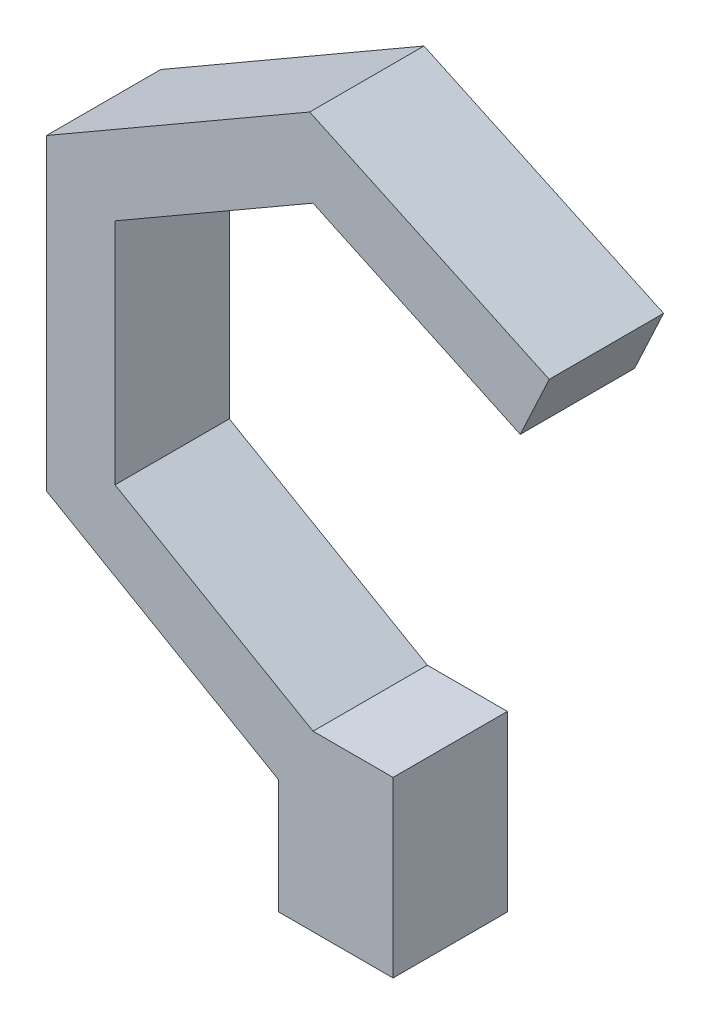
ISO-10303-21;
HEADER;
FILE_DESCRIPTION(('STEP AP214'),'2;1');
FILE_NAME('part.step','',(''),(''),'','','');
FILE_SCHEMA(('AUTOMOTIVE_DESIGN { 1 0 10303 214 1 1 1 1 }'));
ENDSEC;
DATA;
#1=APPLICATION_CONTEXT('core data for automotive mechanical design processes');
#2=APPLICATION_PROTOCOL_DEFINITION('international standard','automotive_design',2000,#1);
#3=PRODUCT_CONTEXT('',#1,'mechanical');
#4=PRODUCT('Part','Part','',(#3));
#5=PRODUCT_RELATED_PRODUCT_CATEGORY('part','',(#4));
#6=PRODUCT_DEFINITION_FORMATION('','',#4);
#7=PRODUCT_DEFINITION_CONTEXT('part definition',#1,'design');
#8=PRODUCT_DEFINITION('design','',#6,#7);
#9=PRODUCT_DEFINITION_SHAPE('','',#8);
#10=(LENGTH_UNIT() NAMED_UNIT(*) SI_UNIT(.MILLI.,.METRE.));
#11=(NAMED_UNIT(*) PLANE_ANGLE_UNIT() SI_UNIT($,.RADIAN.));
#12=(NAMED_UNIT(*) SI_UNIT($,.STERADIAN.) SOLID_ANGLE_UNIT());
#13=UNCERTAINTY_MEASURE_WITH_UNIT(LENGTH_MEASURE(1.E-05),#10,'distance_accuracy_value','');
#14=(GEOMETRIC_REPRESENTATION_CONTEXT(3) GLOBAL_UNCERTAINTY_ASSIGNED_CONTEXT((#13)) GLOBAL_UNIT_ASSIGNED_CONTEXT((#10,
#11,#12)) REPRESENTATION_CONTEXT('',''));
#15=CARTESIAN_POINT('',(0.,0.,0.));
#16=DIRECTION('',(0.,0.,1.));
#17=DIRECTION('',(1.,0.,0.));
#18=AXIS2_PLACEMENT_3D('',#15,#16,#17);
#19=CARTESIAN_POINT('',(0.,-25.4,12.7));
#20=DIRECTION('',(0.,-1.,0.));
#21=DIRECTION('',(0.,0.,-1.));
#22=AXIS2_PLACEMENT_3D('',#19,#20,#21);
#23=PLANE('',#22);
#24=DIRECTION('',(-1.,0.,0.));
#25=VECTOR('',#24,1.);
#26=CARTESIAN_POINT('',(0.,-25.4,0.));
#27=LINE('',#26,#25);
#28=CARTESIAN_POINT('',(8.89,-25.4,0.));
#29=VERTEX_POINT('',#28);
#30=CARTESIAN_POINT('',(0.,-25.4,0.));
#31=VERTEX_POINT('',#30);
#32=EDGE_CURVE('E159',#29,#31,#27,.T.);
#33=ORIENTED_EDGE('',*,*,#32,.T.);
#34=DIRECTION('',(0.,0.,-1.));
#35=VECTOR('',#34,1.);
#36=CARTESIAN_POINT('',(0.,-25.4,12.7));
#37=LINE('',#36,#35);
#38=CARTESIAN_POINT('',(0.,-25.4,12.7));
#39=VERTEX_POINT('',#38);
#40=EDGE_CURVE('E11',#39,#31,#37,.T.);
#41=ORIENTED_EDGE('',*,*,#40,.F.);
#42=DIRECTION('',(-1.,0.,0.));
#43=VECTOR('',#42,1.);
#44=CARTESIAN_POINT('',(0.,-25.4,12.7));
#45=LINE('',#44,#43);
#46=CARTESIAN_POINT('',(8.89,-25.4,12.7));
#47=VERTEX_POINT('',#46);
#48=EDGE_CURVE('E183',#47,#39,#45,.T.);
#49=ORIENTED_EDGE('',*,*,#48,.F.);
#50=DIRECTION('',(0.,0.,-1.));
#51=VECTOR('',#50,1.);
#52=CARTESIAN_POINT('',(8.89,-25.4,12.7));
#53=LINE('',#52,#51);
#54=EDGE_CURVE('E155',#47,#29,#53,.T.);
#55=ORIENTED_EDGE('',*,*,#54,.T.);
#56=EDGE_LOOP('',(#33,#41,#49,#55));
#57=FACE_BOUND('',#56,.T.);
#58=ADVANCED_FACE('F33',(#57),#23,.F.);
#59=CARTESIAN_POINT('',(0.,-25.4,12.7));
#60=DIRECTION('',(-0.5,-0.866025403784439,0.));
#61=DIRECTION('',(0.866025403784439,-0.5,0.));
#62=AXIS2_PLACEMENT_3D('',#59,#60,#61);
#63=PLANE('',#62);
#64=DIRECTION('',(-0.866025403784439,0.5,0.));
#65=VECTOR('',#64,1.);
#66=CARTESIAN_POINT('',(0.,-25.4,0.));
#67=LINE('',#66,#65);
#68=CARTESIAN_POINT('',(-21.9970452561247,-12.7,0.));
#69=VERTEX_POINT('',#68);
#70=EDGE_CURVE('E162',#31,#69,#67,.T.);
#71=ORIENTED_EDGE('',*,*,#70,.T.);
#72=DIRECTION('',(0.,0.,-1.));
#73=VECTOR('',#72,1.);
#74=CARTESIAN_POINT('',(-21.9970452561247,-12.7,12.7));
#75=LINE('',#74,#73);
#76=CARTESIAN_POINT('',(-21.9970452561247,-12.7,12.7));
#77=VERTEX_POINT('',#76);
#78=EDGE_CURVE('E41',#77,#69,#75,.T.);
#79=ORIENTED_EDGE('',*,*,#78,.F.);
#80=DIRECTION('',(-0.866025403784439,0.5,0.));
#81=VECTOR('',#80,1.);
#82=CARTESIAN_POINT('',(0.,-25.4,12.7));
#83=LINE('',#82,#81);
#84=EDGE_CURVE('E107',#39,#77,#83,.T.);
#85=ORIENTED_EDGE('',*,*,#84,.F.);
#86=ORIENTED_EDGE('',*,*,#40,.T.);
#87=EDGE_LOOP('',(#71,#79,#85,#86));
#88=FACE_BOUND('',#87,.T.);
#89=ADVANCED_FACE('F266',(#88),#63,.F.);
#90=CARTESIAN_POINT('',(-21.9970452561247,-12.7,12.7));
#91=DIRECTION('',(-1.,0.,0.));
#92=DIRECTION('',(0.,0.,1.));
#93=AXIS2_PLACEMENT_3D('',#90,#91,#92);
#94=PLANE('',#93);
#95=DIRECTION('',(0.,1.,0.));
#96=VECTOR('',#95,1.);
#97=CARTESIAN_POINT('',(-21.9970452561247,-12.7,0.));
#98=LINE('',#97,#96);
#99=CARTESIAN_POINT('',(-21.9970452561247,12.7,0.));
#100=VERTEX_POINT('',#99);
#101=EDGE_CURVE('E164',#69,#100,#98,.T.);
#102=ORIENTED_EDGE('',*,*,#101,.T.);
#103=DIRECTION('',(0.,0.,-1.));
#104=VECTOR('',#103,1.);
#105=CARTESIAN_POINT('',(-21.9970452561247,12.7,12.7));
#106=LINE('',#105,#104);
#107=CARTESIAN_POINT('',(-21.9970452561247,12.7,12.7));
#108=VERTEX_POINT('',#107);
#109=EDGE_CURVE('E205',#108,#100,#106,.T.);
#110=ORIENTED_EDGE('',*,*,#109,.F.);
#111=DIRECTION('',(0.,1.,0.));
#112=VECTOR('',#111,1.);
#113=CARTESIAN_POINT('',(-21.9970452561247,-12.7,12.7));
#114=LINE('',#113,#112);
#115=EDGE_CURVE('E213',#77,#108,#114,.T.);
#116=ORIENTED_EDGE('',*,*,#115,.F.);
#117=ORIENTED_EDGE('',*,*,#78,.T.);
#118=EDGE_LOOP('',(#102,#110,#116,#117));
#119=FACE_BOUND('',#118,.T.);
#120=ADVANCED_FACE('F211',(#119),#94,.F.);
#121=CARTESIAN_POINT('',(-21.9970452561247,12.7,12.7));
#122=DIRECTION('',(-0.5,0.866025403784439,0.));
#123=DIRECTION('',(-0.866025403784439,-0.5,0.));
#124=AXIS2_PLACEMENT_3D('',#121,#122,#123);
#125=PLANE('',#124);
#126=DIRECTION('',(0.866025403784438,0.5,0.));
#127=VECTOR('',#126,1.);
#128=CARTESIAN_POINT('',(-21.9970452561247,12.7,0.));
#129=LINE('',#128,#127);
#130=CARTESIAN_POINT('',(0.,25.4,0.));
#131=VERTEX_POINT('',#130);
#132=EDGE_CURVE('E166',#100,#131,#129,.T.);
#133=ORIENTED_EDGE('',*,*,#132,.T.);
#134=DIRECTION('',(0.,0.,-1.));
#135=VECTOR('',#134,1.);
#136=CARTESIAN_POINT('',(0.,25.4,12.7));
#137=LINE('',#136,#135);
#138=CARTESIAN_POINT('',(0.,25.4,12.7));
#139=VERTEX_POINT('',#138);
#140=EDGE_CURVE('E202',#139,#131,#137,.T.);
#141=ORIENTED_EDGE('',*,*,#140,.F.);
#142=DIRECTION('',(0.866025403784438,0.5,0.));
#143=VECTOR('',#142,1.);
#144=CARTESIAN_POINT('',(-21.9970452561247,12.7,12.7));
#145=LINE('',#144,#143);
#146=EDGE_CURVE('E231',#108,#139,#145,.T.);
#147=ORIENTED_EDGE('',*,*,#146,.F.);
#148=ORIENTED_EDGE('',*,*,#109,.T.);
#149=EDGE_LOOP('',(#133,#141,#147,#148));
#150=FACE_BOUND('',#149,.T.);
#151=ADVANCED_FACE('F222',(#150),#125,.F.);
#152=CARTESIAN_POINT('',(0.,25.4,12.7));
#153=DIRECTION('',(0.422618261740701,0.906307787036649,0.));
#154=DIRECTION('',(-0.906307787036649,0.422618261740701,0.));
#155=AXIS2_PLACEMENT_3D('',#152,#153,#154);
#156=PLANE('',#155);
#157=DIRECTION('',(0.906307787036649,-0.422618261740701,0.));
#158=VECTOR('',#157,1.);
#159=CARTESIAN_POINT('',(0.,25.4,0.));
#160=LINE('',#159,#158);
#161=CARTESIAN_POINT('',(23.0202177907309,14.6654961517862,0.));
#162=VERTEX_POINT('',#161);
#163=EDGE_CURVE('E168',#131,#162,#160,.T.);
#164=ORIENTED_EDGE('',*,*,#163,.T.);
#165=DIRECTION('',(0.,0.,-1.));
#166=VECTOR('',#165,1.);
#167=CARTESIAN_POINT('',(23.0202177907309,14.6654961517862,12.7));
#168=LINE('',#167,#166);
#169=CARTESIAN_POINT('',(23.0202177907309,14.6654961517862,12.7));
#170=VERTEX_POINT('',#169);
#171=EDGE_CURVE('E199',#170,#162,#168,.T.);
#172=ORIENTED_EDGE('',*,*,#171,.F.);
#173=DIRECTION('',(0.906307787036649,-0.422618261740701,0.));
#174=VECTOR('',#173,1.);
#175=CARTESIAN_POINT('',(0.,25.4,12.7));
#176=LINE('',#175,#174);
#177=EDGE_CURVE('E228',#139,#170,#176,.T.);
#178=ORIENTED_EDGE('',*,*,#177,.F.);
#179=ORIENTED_EDGE('',*,*,#140,.T.);
#180=EDGE_LOOP('',(#164,#172,#178,#179));
#181=FACE_BOUND('',#180,.T.);
#182=ADVANCED_FACE('F226',(#181),#156,.F.);
#183=CARTESIAN_POINT('',(26.240568945195,21.5715614890055,12.7));
#184=DIRECTION('',(-0.906307787036649,0.422618261740702,0.));
#185=DIRECTION('',(-0.422618261740702,-0.906307787036649,0.));
#186=AXIS2_PLACEMENT_3D('',#183,#184,#185);
#187=PLANE('',#186);
#188=DIRECTION('',(0.422618261740702,0.906307787036649,0.));
#189=VECTOR('',#188,1.);
#190=CARTESIAN_POINT('',(26.240568945195,21.5715614890055,0.));
#191=LINE('',#190,#189);
#192=CARTESIAN_POINT('',(26.240568945195,21.5715614890055,0.));
#193=VERTEX_POINT('',#192);
#194=EDGE_CURVE('E170',#162,#193,#191,.T.);
#195=ORIENTED_EDGE('',*,*,#194,.T.);
#196=DIRECTION('',(0.,0.,-1.));
#197=VECTOR('',#196,1.);
#198=CARTESIAN_POINT('',(26.240568945195,21.5715614890055,12.7));
#199=LINE('',#198,#197);
#200=CARTESIAN_POINT('',(26.240568945195,21.5715614890055,12.7));
#201=VERTEX_POINT('',#200);
#202=EDGE_CURVE('E196',#201,#193,#199,.T.);
#203=ORIENTED_EDGE('',*,*,#202,.F.);
#204=DIRECTION('',(0.422618261740702,0.906307787036649,0.));
#205=VECTOR('',#204,1.);
#206=CARTESIAN_POINT('',(26.240568945195,21.5715614890055,12.7));
#207=LINE('',#206,#205);
#208=EDGE_CURVE('E230',#170,#201,#207,.T.);
#209=ORIENTED_EDGE('',*,*,#208,.F.);
#210=ORIENTED_EDGE('',*,*,#171,.T.);
#211=EDGE_LOOP('',(#195,#203,#209,#210));
#212=FACE_BOUND('',#211,.T.);
#213=ADVANCED_FACE('F279',(#212),#187,.F.);
#214=CARTESIAN_POINT('',(-0.374718909049764,33.9824740394396,12.7));
#215=DIRECTION('',(-0.422618261740701,-0.906307787036649,0.));
#216=DIRECTION('',(0.906307787036649,-0.422618261740701,0.));
#217=AXIS2_PLACEMENT_3D('',#214,#215,#216);
#218=PLANE('',#217);
#219=DIRECTION('',(-0.906307787036649,0.422618261740701,0.));
#220=VECTOR('',#219,1.);
#221=CARTESIAN_POINT('',(-0.374718909049764,33.9824740394396,0.));
#222=LINE('',#221,#220);
#223=CARTESIAN_POINT('',(-0.374718909049764,33.9824740394396,0.));
#224=VERTEX_POINT('',#223);
#225=EDGE_CURVE('E172',#193,#224,#222,.T.);
#226=ORIENTED_EDGE('',*,*,#225,.T.);
#227=DIRECTION('',(0.,0.,-1.));
#228=VECTOR('',#227,1.);
#229=CARTESIAN_POINT('',(-0.374718909049764,33.9824740394396,12.7));
#230=LINE('',#229,#228);
#231=CARTESIAN_POINT('',(-0.374718909049764,33.9824740394396,12.7));
#232=VERTEX_POINT('',#231);
#233=EDGE_CURVE('E193',#232,#224,#230,.T.);
#234=ORIENTED_EDGE('',*,*,#233,.F.);
#235=DIRECTION('',(-0.906307787036649,0.422618261740701,0.));
#236=VECTOR('',#235,1.);
#237=CARTESIAN_POINT('',(-0.374718909049764,33.9824740394396,12.7));
#238=LINE('',#237,#236);
#239=EDGE_CURVE('E233',#201,#232,#238,.T.);
#240=ORIENTED_EDGE('',*,*,#239,.F.);
#241=ORIENTED_EDGE('',*,*,#202,.T.);
#242=EDGE_LOOP('',(#226,#234,#240,#241));
#243=FACE_BOUND('',#242,.T.);
#244=ADVANCED_FACE('F282',(#243),#218,.F.);
#245=CARTESIAN_POINT('',(-29.6170452561247,17.0994090512249,12.7));
#246=DIRECTION('',(0.5,-0.866025403784438,0.));
#247=DIRECTION('',(0.866025403784439,0.5,0.));
#248=AXIS2_PLACEMENT_3D('',#245,#246,#247);
#249=PLANE('',#248);
#250=DIRECTION('',(-0.866025403784439,-0.5,0.));
#251=VECTOR('',#250,1.);
#252=CARTESIAN_POINT('',(-29.6170452561247,17.0994090512249,0.));
#253=LINE('',#252,#251);
#254=CARTESIAN_POINT('',(-29.6170452561247,17.0994090512249,0.));
#255=VERTEX_POINT('',#254);
#256=EDGE_CURVE('E174',#224,#255,#253,.T.);
#257=ORIENTED_EDGE('',*,*,#256,.T.);
#258=DIRECTION('',(0.,0.,-1.));
#259=VECTOR('',#258,1.);
#260=CARTESIAN_POINT('',(-29.6170452561247,17.0994090512249,12.7));
#261=LINE('',#260,#259);
#262=CARTESIAN_POINT('',(-29.6170452561247,17.0994090512249,12.7));
#263=VERTEX_POINT('',#262);
#264=EDGE_CURVE('E190',#263,#255,#261,.T.);
#265=ORIENTED_EDGE('',*,*,#264,.F.);
#266=DIRECTION('',(-0.866025403784439,-0.5,0.));
#267=VECTOR('',#266,1.);
#268=CARTESIAN_POINT('',(-29.6170452561247,17.0994090512249,12.7));
#269=LINE('',#268,#267);
#270=EDGE_CURVE('E239',#232,#263,#269,.T.);
#271=ORIENTED_EDGE('',*,*,#270,.F.);
#272=ORIENTED_EDGE('',*,*,#233,.T.);
#273=EDGE_LOOP('',(#257,#265,#271,#272));
#274=FACE_BOUND('',#273,.T.);
#275=ADVANCED_FACE('F286',(#274),#249,.F.);
#276=CARTESIAN_POINT('',(-29.6170452561247,-17.0994090512249,12.7));
#277=DIRECTION('',(1.,0.,0.));
#278=DIRECTION('',(0.,0.,-1.));
#279=AXIS2_PLACEMENT_3D('',#276,#277,#278);
#280=PLANE('',#279);
#281=DIRECTION('',(0.,-1.,0.));
#282=VECTOR('',#281,1.);
#283=CARTESIAN_POINT('',(-29.6170452561247,-17.0994090512249,0.));
#284=LINE('',#283,#282);
#285=CARTESIAN_POINT('',(-29.6170452561247,-17.0994090512249,0.));
#286=VERTEX_POINT('',#285);
#287=EDGE_CURVE('E176',#255,#286,#284,.T.);
#288=ORIENTED_EDGE('',*,*,#287,.T.);
#289=DIRECTION('',(0.,0.,-1.));
#290=VECTOR('',#289,1.);
#291=CARTESIAN_POINT('',(-29.6170452561247,-17.0994090512249,12.7));
#292=LINE('',#291,#290);
#293=CARTESIAN_POINT('',(-29.6170452561247,-17.0994090512249,12.7));
#294=VERTEX_POINT('',#293);
#295=EDGE_CURVE('E187',#294,#286,#292,.T.);
#296=ORIENTED_EDGE('',*,*,#295,.F.);
#297=DIRECTION('',(0.,-1.,0.));
#298=VECTOR('',#297,1.);
#299=CARTESIAN_POINT('',(-29.6170452561247,-17.0994090512249,12.7));
#300=LINE('',#299,#298);
#301=EDGE_CURVE('E241',#263,#294,#300,.T.);
#302=ORIENTED_EDGE('',*,*,#301,.F.);
#303=ORIENTED_EDGE('',*,*,#264,.T.);
#304=EDGE_LOOP('',(#288,#296,#302,#303));
#305=FACE_BOUND('',#304,.T.);
#306=ADVANCED_FACE('F247',(#305),#280,.F.);
#307=CARTESIAN_POINT('',(-3.81,-31.9991135768374,12.7));
#308=DIRECTION('',(0.5,0.866025403784439,0.));
#309=DIRECTION('',(-0.866025403784439,0.5,0.));
#310=AXIS2_PLACEMENT_3D('',#307,#308,#309);
#311=PLANE('',#310);
#312=DIRECTION('',(0.866025403784439,-0.5,0.));
#313=VECTOR('',#312,1.);
#314=CARTESIAN_POINT('',(-3.81,-31.9991135768374,0.));
#315=LINE('',#314,#313);
#316=CARTESIAN_POINT('',(-3.81,-31.9991135768374,0.));
#317=VERTEX_POINT('',#316);
#318=EDGE_CURVE('E178',#286,#317,#315,.T.);
#319=ORIENTED_EDGE('',*,*,#318,.T.);
#320=DIRECTION('',(0.,0.,-1.));
#321=VECTOR('',#320,1.);
#322=CARTESIAN_POINT('',(-3.81,-31.9991135768374,12.7));
#323=LINE('',#322,#321);
#324=CARTESIAN_POINT('',(-3.81,-31.9991135768374,12.7));
#325=VERTEX_POINT('',#324);
#326=EDGE_CURVE('E150',#325,#317,#323,.T.);
#327=ORIENTED_EDGE('',*,*,#326,.F.);
#328=DIRECTION('',(0.866025403784439,-0.5,0.));
#329=VECTOR('',#328,1.);
#330=CARTESIAN_POINT('',(-3.81,-31.9991135768374,12.7));
#331=LINE('',#330,#329);
#332=EDGE_CURVE('E141',#294,#325,#331,.T.);
#333=ORIENTED_EDGE('',*,*,#332,.F.);
#334=ORIENTED_EDGE('',*,*,#295,.T.);
#335=EDGE_LOOP('',(#319,#327,#333,#334));
#336=FACE_BOUND('',#335,.T.);
#337=ADVANCED_FACE('F251',(#336),#311,.F.);
#338=CARTESIAN_POINT('',(-3.81,-31.9991135768374,12.7));
#339=DIRECTION('',(1.,0.,0.));
#340=DIRECTION('',(0.,1.,0.));
#341=AXIS2_PLACEMENT_3D('',#338,#339,#340);
#342=PLANE('',#341);
#343=DIRECTION('',(0.,-1.,0.));
#344=VECTOR('',#343,1.);
#345=CARTESIAN_POINT('',(-3.81,-31.9991135768374,0.));
#346=LINE('',#345,#344);
#347=CARTESIAN_POINT('',(-3.81,-44.6991135768374,0.));
#348=VERTEX_POINT('',#347);
#349=EDGE_CURVE('E149',#317,#348,#346,.T.);
#350=ORIENTED_EDGE('',*,*,#349,.T.);
#351=DIRECTION('',(0.,0.,-1.));
#352=VECTOR('',#351,1.);
#353=CARTESIAN_POINT('',(-3.81,-44.6991135768374,12.7));
#354=LINE('',#353,#352);
#355=CARTESIAN_POINT('',(-3.81,-44.6991135768374,12.7));
#356=VERTEX_POINT('',#355);
#357=EDGE_CURVE('E146',#356,#348,#354,.T.);
#358=ORIENTED_EDGE('',*,*,#357,.F.);
#359=DIRECTION('',(0.,-1.,0.));
#360=VECTOR('',#359,1.);
#361=CARTESIAN_POINT('',(-3.81,-31.9991135768374,12.7));
#362=LINE('',#361,#360);
#363=EDGE_CURVE('E135',#325,#356,#362,.T.);
#364=ORIENTED_EDGE('',*,*,#363,.F.);
#365=ORIENTED_EDGE('',*,*,#326,.T.);
#366=EDGE_LOOP('',(#350,#358,#364,#365));
#367=FACE_BOUND('',#366,.T.);
#368=ADVANCED_FACE('F147',(#367),#342,.F.);
#369=CARTESIAN_POINT('',(-3.81,-44.6991135768374,12.7));
#370=DIRECTION('',(0.,1.,0.));
#371=DIRECTION('',(0.,0.,1.));
#372=AXIS2_PLACEMENT_3D('',#369,#370,#371);
#373=PLANE('',#372);
#374=DIRECTION('',(1.,0.,0.));
#375=VECTOR('',#374,1.);
#376=CARTESIAN_POINT('',(-3.81,-44.6991135768374,0.));
#377=LINE('',#376,#375);
#378=CARTESIAN_POINT('',(8.89,-44.6991135768374,0.));
#379=VERTEX_POINT('',#378);
#380=EDGE_CURVE('E93',#348,#379,#377,.T.);
#381=ORIENTED_EDGE('',*,*,#380,.T.);
#382=DIRECTION('',(0.,0.,-1.));
#383=VECTOR('',#382,1.);
#384=CARTESIAN_POINT('',(8.89,-44.6991135768374,12.7));
#385=LINE('',#384,#383);
#386=CARTESIAN_POINT('',(8.89,-44.6991135768374,12.7));
#387=VERTEX_POINT('',#386);
#388=EDGE_CURVE('E151',#387,#379,#385,.T.);
#389=ORIENTED_EDGE('',*,*,#388,.F.);
#390=DIRECTION('',(1.,0.,0.));
#391=VECTOR('',#390,1.);
#392=CARTESIAN_POINT('',(-3.81,-44.6991135768374,12.7));
#393=LINE('',#392,#391);
#394=EDGE_CURVE('E139',#356,#387,#393,.T.);
#395=ORIENTED_EDGE('',*,*,#394,.F.);
#396=ORIENTED_EDGE('',*,*,#357,.T.);
#397=EDGE_LOOP('',(#381,#389,#395,#396));
#398=FACE_BOUND('',#397,.T.);
#399=ADVANCED_FACE('F153',(#398),#373,.F.);
#400=CARTESIAN_POINT('',(8.89,-25.4,12.7));
#401=DIRECTION('',(-1.,0.,0.));
#402=DIRECTION('',(0.,-1.,0.));
#403=AXIS2_PLACEMENT_3D('',#400,#401,#402);
#404=PLANE('',#403);
#405=DIRECTION('',(0.,1.,0.));
#406=VECTOR('',#405,1.);
#407=CARTESIAN_POINT('',(8.89,-25.4,0.));
#408=LINE('',#407,#406);
#409=EDGE_CURVE('E99',#379,#29,#408,.T.);
#410=ORIENTED_EDGE('',*,*,#409,.T.);
#411=ORIENTED_EDGE('',*,*,#54,.F.);
#412=DIRECTION('',(0.,1.,0.));
#413=VECTOR('',#412,1.);
#414=CARTESIAN_POINT('',(8.89,-25.4,12.7));
#415=LINE('',#414,#413);
#416=EDGE_CURVE('E49',#387,#47,#415,.T.);
#417=ORIENTED_EDGE('',*,*,#416,.F.);
#418=ORIENTED_EDGE('',*,*,#388,.T.);
#419=EDGE_LOOP('',(#410,#411,#417,#418));
#420=FACE_BOUND('',#419,.T.);
#421=ADVANCED_FACE('F255',(#420),#404,.F.);
#422=CARTESIAN_POINT('',(0.,0.,12.7));
#423=DIRECTION('',(0.,0.,-1.));
#424=DIRECTION('',(-1.,0.,0.));
#425=AXIS2_PLACEMENT_3D('',#422,#423,#424);
#426=PLANE('',#425);
#427=ORIENTED_EDGE('',*,*,#48,.T.);
#428=ORIENTED_EDGE('',*,*,#84,.T.);
#429=ORIENTED_EDGE('',*,*,#115,.T.);
#430=ORIENTED_EDGE('',*,*,#146,.T.);
#431=ORIENTED_EDGE('',*,*,#177,.T.);
#432=ORIENTED_EDGE('',*,*,#208,.T.);
#433=ORIENTED_EDGE('',*,*,#239,.T.);
#434=ORIENTED_EDGE('',*,*,#270,.T.);
#435=ORIENTED_EDGE('',*,*,#301,.T.);
#436=ORIENTED_EDGE('',*,*,#332,.T.);
#437=ORIENTED_EDGE('',*,*,#363,.T.);
#438=ORIENTED_EDGE('',*,*,#394,.T.);
#439=ORIENTED_EDGE('',*,*,#416,.T.);
#440=EDGE_LOOP('',(#427,#428,#429,#430,#431,#432,#433,#434,#435,#436,#437,#438,#439));
#441=FACE_BOUND('',#440,.T.);
#442=ADVANCED_FACE('F137',(#441),#426,.F.);
#443=CARTESIAN_POINT('',(0.,0.,0.));
#444=DIRECTION('',(0.,0.,-1.));
#445=DIRECTION('',(-1.,0.,0.));
#446=AXIS2_PLACEMENT_3D('',#443,#444,#445);
#447=PLANE('',#446);
#448=ORIENTED_EDGE('',*,*,#32,.F.);
#449=ORIENTED_EDGE('',*,*,#409,.F.);
#450=ORIENTED_EDGE('',*,*,#380,.F.);
#451=ORIENTED_EDGE('',*,*,#349,.F.);
#452=ORIENTED_EDGE('',*,*,#318,.F.);
#453=ORIENTED_EDGE('',*,*,#287,.F.);
#454=ORIENTED_EDGE('',*,*,#256,.F.);
#455=ORIENTED_EDGE('',*,*,#225,.F.);
#456=ORIENTED_EDGE('',*,*,#194,.F.);
#457=ORIENTED_EDGE('',*,*,#163,.F.);
#458=ORIENTED_EDGE('',*,*,#132,.F.);
#459=ORIENTED_EDGE('',*,*,#101,.F.);
#460=ORIENTED_EDGE('',*,*,#70,.F.);
#461=EDGE_LOOP('',(#448,#449,#450,#451,#452,#453,#454,#455,#456,#457,#458,#459,#460));
#462=FACE_BOUND('',#461,.T.);
#463=ADVANCED_FACE('F217',(#462),#447,.T.);
#464=CLOSED_SHELL('',(#58,#89,#120,#151,#182,#213,#244,#275,#306,#337,#368,#399,#421,#442,#463));
#465=MANIFOLD_SOLID_BREP('B2',#464);
#466=ADVANCED_BREP_SHAPE_REPRESENTATION('',(#18,#465),#14);
#467=SHAPE_DEFINITION_REPRESENTATION(#9,#466);
ENDSEC;
END-ISO-10303-21;
